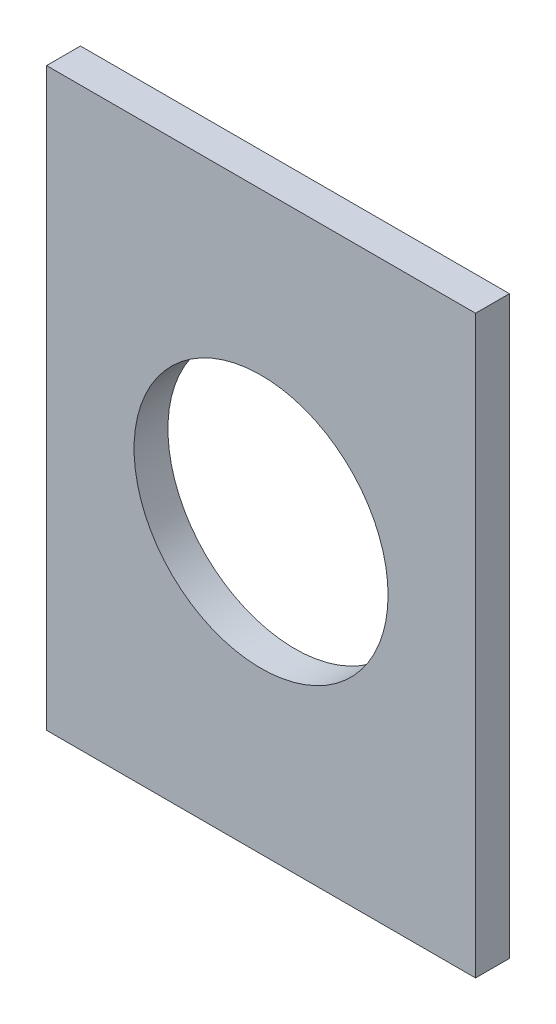
ISO-10303-21;
HEADER;
FILE_DESCRIPTION(('STEP AP214'),'2;1');
FILE_NAME('part.step','',(''),(''),'','','');
FILE_SCHEMA(('AUTOMOTIVE_DESIGN { 1 0 10303 214 1 1 1 1 }'));
ENDSEC;
DATA;
#1=APPLICATION_CONTEXT('core data for automotive mechanical design processes');
#2=APPLICATION_PROTOCOL_DEFINITION('international standard','automotive_design',2000,#1);
#3=PRODUCT_CONTEXT('',#1,'mechanical');
#4=PRODUCT('Part','Part','',(#3));
#5=PRODUCT_RELATED_PRODUCT_CATEGORY('part','',(#4));
#6=PRODUCT_DEFINITION_FORMATION('','',#4);
#7=PRODUCT_DEFINITION_CONTEXT('part definition',#1,'design');
#8=PRODUCT_DEFINITION('design','',#6,#7);
#9=PRODUCT_DEFINITION_SHAPE('','',#8);
#10=(LENGTH_UNIT() NAMED_UNIT(*) SI_UNIT(.MILLI.,.METRE.));
#11=(NAMED_UNIT(*) PLANE_ANGLE_UNIT() SI_UNIT($,.RADIAN.));
#12=(NAMED_UNIT(*) SI_UNIT($,.STERADIAN.) SOLID_ANGLE_UNIT());
#13=UNCERTAINTY_MEASURE_WITH_UNIT(LENGTH_MEASURE(1.E-05),#10,'distance_accuracy_value','');
#14=(GEOMETRIC_REPRESENTATION_CONTEXT(3) GLOBAL_UNCERTAINTY_ASSIGNED_CONTEXT((#13)) GLOBAL_UNIT_ASSIGNED_CONTEXT((#10,
#11,#12)) REPRESENTATION_CONTEXT('',''));
#15=CARTESIAN_POINT('',(0.,0.,0.));
#16=DIRECTION('',(0.,0.,1.));
#17=DIRECTION('',(1.,0.,0.));
#18=AXIS2_PLACEMENT_3D('',#15,#16,#17);
#19=CARTESIAN_POINT('',(-19.,-25.5,3.));
#20=DIRECTION('',(0.,0.,-1.));
#21=DIRECTION('',(-1.,0.,0.));
#22=AXIS2_PLACEMENT_3D('',#19,#20,#21);
#23=PLANE('',#22);
#24=DIRECTION('',(0.,-1.,0.));
#25=VECTOR('',#24,1.);
#26=CARTESIAN_POINT('',(-19.,25.5,3.));
#27=LINE('',#26,#25);
#28=CARTESIAN_POINT('',(-19.,25.5,3.));
#29=VERTEX_POINT('',#28);
#30=CARTESIAN_POINT('',(-19.,-25.5,3.));
#31=VERTEX_POINT('',#30);
#32=EDGE_CURVE('E97',#29,#31,#27,.T.);
#33=ORIENTED_EDGE('',*,*,#32,.T.);
#34=DIRECTION('',(-1.,0.,0.));
#35=VECTOR('',#34,1.);
#36=CARTESIAN_POINT('',(19.,-25.5,3.));
#37=LINE('',#36,#35);
#38=CARTESIAN_POINT('',(19.,-25.5,3.));
#39=VERTEX_POINT('',#38);
#40=EDGE_CURVE('E78',#39,#31,#37,.T.);
#41=ORIENTED_EDGE('',*,*,#40,.F.);
#42=DIRECTION('',(0.,1.,0.));
#43=VECTOR('',#42,1.);
#44=CARTESIAN_POINT('',(19.,-25.5,3.));
#45=LINE('',#44,#43);
#46=CARTESIAN_POINT('',(19.,25.5,3.));
#47=VERTEX_POINT('',#46);
#48=EDGE_CURVE('E53',#39,#47,#45,.T.);
#49=ORIENTED_EDGE('',*,*,#48,.T.);
#50=DIRECTION('',(1.,0.,0.));
#51=VECTOR('',#50,1.);
#52=CARTESIAN_POINT('',(-19.,25.5,3.));
#53=LINE('',#52,#51);
#54=EDGE_CURVE('E101',#29,#47,#53,.T.);
#55=ORIENTED_EDGE('',*,*,#54,.F.);
#56=EDGE_LOOP('',(#33,#41,#49,#55));
#57=FACE_BOUND('',#56,.T.);
#58=CARTESIAN_POINT('',(0.,0.,3.));
#59=DIRECTION('',(0.,0.,1.));
#60=DIRECTION('',(1.,0.,0.));
#61=AXIS2_PLACEMENT_3D('',#58,#59,#60);
#62=CIRCLE('',#61,11.25);
#63=CARTESIAN_POINT('',(11.25,0.,3.));
#64=VERTEX_POINT('',#63);
#65=EDGE_CURVE('E84',#64,#64,#62,.T.);
#66=ORIENTED_EDGE('',*,*,#65,.F.);
#67=EDGE_LOOP('',(#66));
#68=FACE_BOUND('',#67,.T.);
#69=ADVANCED_FACE('F30',(#57,#68),#23,.F.);
#70=CARTESIAN_POINT('',(-19.,-25.5,0.));
#71=DIRECTION('',(0.,0.,-1.));
#72=DIRECTION('',(-1.,0.,0.));
#73=AXIS2_PLACEMENT_3D('',#70,#71,#72);
#74=PLANE('',#73);
#75=DIRECTION('',(0.,-1.,0.));
#76=VECTOR('',#75,1.);
#77=CARTESIAN_POINT('',(-19.,25.5,0.));
#78=LINE('',#77,#76);
#79=CARTESIAN_POINT('',(-19.,25.5,0.));
#80=VERTEX_POINT('',#79);
#81=CARTESIAN_POINT('',(-19.,-25.5,0.));
#82=VERTEX_POINT('',#81);
#83=EDGE_CURVE('E81',#80,#82,#78,.T.);
#84=ORIENTED_EDGE('',*,*,#83,.F.);
#85=DIRECTION('',(1.,0.,0.));
#86=VECTOR('',#85,1.);
#87=CARTESIAN_POINT('',(-19.,25.5,0.));
#88=LINE('',#87,#86);
#89=CARTESIAN_POINT('',(19.,25.5,0.));
#90=VERTEX_POINT('',#89);
#91=EDGE_CURVE('E92',#80,#90,#88,.T.);
#92=ORIENTED_EDGE('',*,*,#91,.T.);
#93=DIRECTION('',(0.,1.,0.));
#94=VECTOR('',#93,1.);
#95=CARTESIAN_POINT('',(19.,-25.5,0.));
#96=LINE('',#95,#94);
#97=CARTESIAN_POINT('',(19.,-25.5,0.));
#98=VERTEX_POINT('',#97);
#99=EDGE_CURVE('E90',#98,#90,#96,.T.);
#100=ORIENTED_EDGE('',*,*,#99,.F.);
#101=DIRECTION('',(-1.,0.,0.));
#102=VECTOR('',#101,1.);
#103=CARTESIAN_POINT('',(19.,-25.5,0.));
#104=LINE('',#103,#102);
#105=EDGE_CURVE('E77',#98,#82,#104,.T.);
#106=ORIENTED_EDGE('',*,*,#105,.T.);
#107=EDGE_LOOP('',(#84,#92,#100,#106));
#108=FACE_BOUND('',#107,.T.);
#109=CARTESIAN_POINT('',(0.,0.,0.));
#110=DIRECTION('',(0.,0.,1.));
#111=DIRECTION('',(1.,0.,0.));
#112=AXIS2_PLACEMENT_3D('',#109,#110,#111);
#113=CIRCLE('',#112,11.25);
#114=CARTESIAN_POINT('',(11.25,0.,0.));
#115=VERTEX_POINT('',#114);
#116=EDGE_CURVE('E170',#115,#115,#113,.T.);
#117=ORIENTED_EDGE('',*,*,#116,.T.);
#118=EDGE_LOOP('',(#117));
#119=FACE_BOUND('',#118,.T.);
#120=ADVANCED_FACE('F87',(#108,#119),#74,.T.);
#121=CARTESIAN_POINT('',(-19.,25.5,3.));
#122=DIRECTION('',(1.,0.,0.));
#123=DIRECTION('',(0.,1.,0.));
#124=AXIS2_PLACEMENT_3D('',#121,#122,#123);
#125=PLANE('',#124);
#126=ORIENTED_EDGE('',*,*,#83,.T.);
#127=DIRECTION('',(0.,0.,-1.));
#128=VECTOR('',#127,1.);
#129=CARTESIAN_POINT('',(-19.,-25.5,3.));
#130=LINE('',#129,#128);
#131=EDGE_CURVE('E11',#31,#82,#130,.T.);
#132=ORIENTED_EDGE('',*,*,#131,.F.);
#133=ORIENTED_EDGE('',*,*,#32,.F.);
#134=DIRECTION('',(0.,0.,-1.));
#135=VECTOR('',#134,1.);
#136=CARTESIAN_POINT('',(-19.,25.5,3.));
#137=LINE('',#136,#135);
#138=EDGE_CURVE('E45',#29,#80,#137,.T.);
#139=ORIENTED_EDGE('',*,*,#138,.T.);
#140=EDGE_LOOP('',(#126,#132,#133,#139));
#141=FACE_BOUND('',#140,.T.);
#142=ADVANCED_FACE('F32',(#141),#125,.F.);
#143=CARTESIAN_POINT('',(19.,-25.5,3.));
#144=DIRECTION('',(0.,-1.,0.));
#145=DIRECTION('',(0.,0.,-1.));
#146=AXIS2_PLACEMENT_3D('',#143,#144,#145);
#147=PLANE('',#146);
#148=ORIENTED_EDGE('',*,*,#105,.F.);
#149=DIRECTION('',(0.,0.,-1.));
#150=VECTOR('',#149,1.);
#151=CARTESIAN_POINT('',(19.,-25.5,3.));
#152=LINE('',#151,#150);
#153=EDGE_CURVE('E38',#39,#98,#152,.T.);
#154=ORIENTED_EDGE('',*,*,#153,.F.);
#155=ORIENTED_EDGE('',*,*,#40,.T.);
#156=ORIENTED_EDGE('',*,*,#131,.T.);
#157=EDGE_LOOP('',(#148,#154,#155,#156));
#158=FACE_BOUND('',#157,.T.);
#159=ADVANCED_FACE('F75',(#158),#147,.T.);
#160=CARTESIAN_POINT('',(19.,-25.5,3.));
#161=DIRECTION('',(-1.,0.,0.));
#162=DIRECTION('',(0.,-1.,0.));
#163=AXIS2_PLACEMENT_3D('',#160,#161,#162);
#164=PLANE('',#163);
#165=ORIENTED_EDGE('',*,*,#99,.T.);
#166=DIRECTION('',(0.,0.,-1.));
#167=VECTOR('',#166,1.);
#168=CARTESIAN_POINT('',(19.,25.5,3.));
#169=LINE('',#168,#167);
#170=EDGE_CURVE('E104',#47,#90,#169,.T.);
#171=ORIENTED_EDGE('',*,*,#170,.F.);
#172=ORIENTED_EDGE('',*,*,#48,.F.);
#173=ORIENTED_EDGE('',*,*,#153,.T.);
#174=EDGE_LOOP('',(#165,#171,#172,#173));
#175=FACE_BOUND('',#174,.T.);
#176=ADVANCED_FACE('F106',(#175),#164,.F.);
#177=CARTESIAN_POINT('',(-19.,25.5,3.));
#178=DIRECTION('',(0.,1.,0.));
#179=DIRECTION('',(-1.,0.,0.));
#180=AXIS2_PLACEMENT_3D('',#177,#178,#179);
#181=PLANE('',#180);
#182=ORIENTED_EDGE('',*,*,#91,.F.);
#183=ORIENTED_EDGE('',*,*,#138,.F.);
#184=ORIENTED_EDGE('',*,*,#54,.T.);
#185=ORIENTED_EDGE('',*,*,#170,.T.);
#186=EDGE_LOOP('',(#182,#183,#184,#185));
#187=FACE_BOUND('',#186,.T.);
#188=ADVANCED_FACE('F108',(#187),#181,.T.);
#189=CARTESIAN_POINT('',(0.,0.,3.));
#190=DIRECTION('',(0.,0.,-1.));
#191=DIRECTION('',(-1.,0.,0.));
#192=AXIS2_PLACEMENT_3D('',#189,#190,#191);
#193=CYLINDRICAL_SURFACE('',#192,11.25);
#194=ORIENTED_EDGE('',*,*,#65,.T.);
#195=EDGE_LOOP('',(#194));
#196=FACE_BOUND('',#195,.T.);
#197=ORIENTED_EDGE('',*,*,#116,.F.);
#198=EDGE_LOOP('',(#197));
#199=FACE_BOUND('',#198,.T.);
#200=ADVANCED_FACE('F110',(#196,#199),#193,.F.);
#201=CLOSED_SHELL('',(#69,#120,#142,#159,#176,#188,#200));
#202=MANIFOLD_SOLID_BREP('B2',#201);
#203=ADVANCED_BREP_SHAPE_REPRESENTATION('',(#18,#202),#14);
#204=SHAPE_DEFINITION_REPRESENTATION(#9,#203);
ENDSEC;
END-ISO-10303-21;
